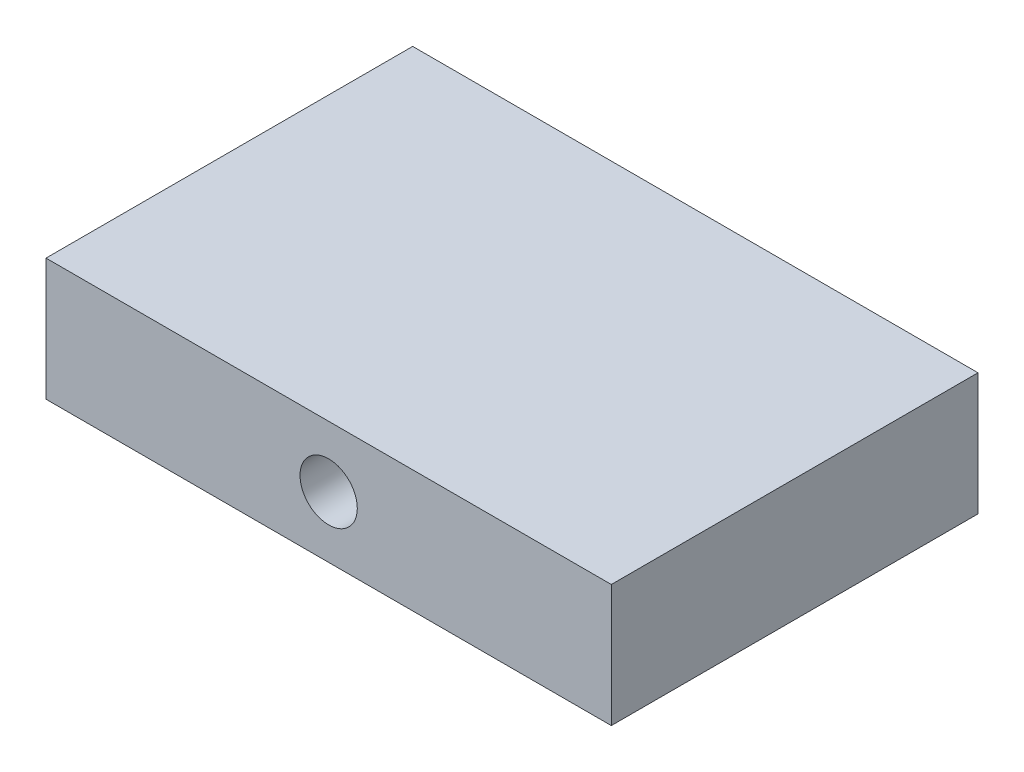
ISO-10303-21;
HEADER;
FILE_DESCRIPTION(('STEP AP214'),'2;1');
FILE_NAME('part.step','',(''),(''),'','','');
FILE_SCHEMA(('AUTOMOTIVE_DESIGN { 1 0 10303 214 1 1 1 1 }'));
ENDSEC;
DATA;
#1=APPLICATION_CONTEXT('core data for automotive mechanical design processes');
#2=APPLICATION_PROTOCOL_DEFINITION('international standard','automotive_design',2000,#1);
#3=PRODUCT_CONTEXT('',#1,'mechanical');
#4=PRODUCT('Part','Part','',(#3));
#5=PRODUCT_RELATED_PRODUCT_CATEGORY('part','',(#4));
#6=PRODUCT_DEFINITION_FORMATION('','',#4);
#7=PRODUCT_DEFINITION_CONTEXT('part definition',#1,'design');
#8=PRODUCT_DEFINITION('design','',#6,#7);
#9=PRODUCT_DEFINITION_SHAPE('','',#8);
#10=(LENGTH_UNIT() NAMED_UNIT(*) SI_UNIT(.MILLI.,.METRE.));
#11=(NAMED_UNIT(*) PLANE_ANGLE_UNIT() SI_UNIT($,.RADIAN.));
#12=(NAMED_UNIT(*) SI_UNIT($,.STERADIAN.) SOLID_ANGLE_UNIT());
#13=UNCERTAINTY_MEASURE_WITH_UNIT(LENGTH_MEASURE(1.E-05),#10,'distance_accuracy_value','');
#14=(GEOMETRIC_REPRESENTATION_CONTEXT(3) GLOBAL_UNCERTAINTY_ASSIGNED_CONTEXT((#13)) GLOBAL_UNIT_ASSIGNED_CONTEXT((#10,
#11,#12)) REPRESENTATION_CONTEXT('',''));
#15=CARTESIAN_POINT('',(0.,0.,0.));
#16=DIRECTION('',(0.,0.,1.));
#17=DIRECTION('',(1.,0.,0.));
#18=AXIS2_PLACEMENT_3D('',#15,#16,#17);
#19=CARTESIAN_POINT('',(-37.,16.,24.));
#20=DIRECTION('',(1.,0.,0.));
#21=DIRECTION('',(0.,0.,-1.));
#22=AXIS2_PLACEMENT_3D('',#19,#20,#21);
#23=PLANE('',#22);
#24=DIRECTION('',(0.,0.,1.));
#25=VECTOR('',#24,1.);
#26=CARTESIAN_POINT('',(-37.,0.,24.));
#27=LINE('',#26,#25);
#28=CARTESIAN_POINT('',(-37.,0.,-24.));
#29=VERTEX_POINT('',#28);
#30=CARTESIAN_POINT('',(-37.,0.,24.));
#31=VERTEX_POINT('',#30);
#32=EDGE_CURVE('E98',#29,#31,#27,.T.);
#33=ORIENTED_EDGE('',*,*,#32,.T.);
#34=DIRECTION('',(0.,-1.,0.));
#35=VECTOR('',#34,1.);
#36=CARTESIAN_POINT('',(-37.,16.,24.));
#37=LINE('',#36,#35);
#38=CARTESIAN_POINT('',(-37.,16.,24.));
#39=VERTEX_POINT('',#38);
#40=EDGE_CURVE('E11',#39,#31,#37,.T.);
#41=ORIENTED_EDGE('',*,*,#40,.F.);
#42=DIRECTION('',(0.,0.,1.));
#43=VECTOR('',#42,1.);
#44=CARTESIAN_POINT('',(-37.,16.,24.));
#45=LINE('',#44,#43);
#46=CARTESIAN_POINT('',(-37.,16.,-24.));
#47=VERTEX_POINT('',#46);
#48=EDGE_CURVE('E86',#47,#39,#45,.T.);
#49=ORIENTED_EDGE('',*,*,#48,.F.);
#50=DIRECTION('',(0.,-1.,0.));
#51=VECTOR('',#50,1.);
#52=CARTESIAN_POINT('',(-37.,16.,-24.));
#53=LINE('',#52,#51);
#54=EDGE_CURVE('E94',#47,#29,#53,.T.);
#55=ORIENTED_EDGE('',*,*,#54,.T.);
#56=EDGE_LOOP('',(#33,#41,#49,#55));
#57=FACE_BOUND('',#56,.T.);
#58=ADVANCED_FACE('F35',(#57),#23,.F.);
#59=CARTESIAN_POINT('',(37.,16.,24.));
#60=DIRECTION('',(0.,0.,-1.));
#61=DIRECTION('',(-1.,0.,0.));
#62=AXIS2_PLACEMENT_3D('',#59,#60,#61);
#63=PLANE('',#62);
#64=CARTESIAN_POINT('',(0.,8.,24.));
#65=DIRECTION('',(0.,0.,1.));
#66=DIRECTION('',(1.,0.,0.));
#67=AXIS2_PLACEMENT_3D('',#64,#65,#66);
#68=CIRCLE('',#67,3.75000000000001);
#69=CARTESIAN_POINT('',(3.75000000000001,8.,24.));
#70=VERTEX_POINT('',#69);
#71=EDGE_CURVE('E112',#70,#70,#68,.T.);
#72=ORIENTED_EDGE('',*,*,#71,.F.);
#73=EDGE_LOOP('',(#72));
#74=FACE_BOUND('',#73,.T.);
#75=DIRECTION('',(1.,0.,0.));
#76=VECTOR('',#75,1.);
#77=CARTESIAN_POINT('',(37.,0.,24.));
#78=LINE('',#77,#76);
#79=CARTESIAN_POINT('',(37.,0.,24.));
#80=VERTEX_POINT('',#79);
#81=EDGE_CURVE('E90',#31,#80,#78,.T.);
#82=ORIENTED_EDGE('',*,*,#81,.T.);
#83=DIRECTION('',(0.,-1.,0.));
#84=VECTOR('',#83,1.);
#85=CARTESIAN_POINT('',(37.,16.,24.));
#86=LINE('',#85,#84);
#87=CARTESIAN_POINT('',(37.,16.,24.));
#88=VERTEX_POINT('',#87);
#89=EDGE_CURVE('E43',#88,#80,#86,.T.);
#90=ORIENTED_EDGE('',*,*,#89,.F.);
#91=DIRECTION('',(1.,0.,0.));
#92=VECTOR('',#91,1.);
#93=CARTESIAN_POINT('',(37.,16.,24.));
#94=LINE('',#93,#92);
#95=EDGE_CURVE('E81',#39,#88,#94,.T.);
#96=ORIENTED_EDGE('',*,*,#95,.F.);
#97=ORIENTED_EDGE('',*,*,#40,.T.);
#98=EDGE_LOOP('',(#82,#90,#96,#97));
#99=FACE_BOUND('',#98,.T.);
#100=ADVANCED_FACE('F89',(#74,#99),#63,.F.);
#101=CARTESIAN_POINT('',(37.,16.,24.));
#102=DIRECTION('',(-1.,0.,0.));
#103=DIRECTION('',(0.,0.,1.));
#104=AXIS2_PLACEMENT_3D('',#101,#102,#103);
#105=PLANE('',#104);
#106=DIRECTION('',(0.,0.,-1.));
#107=VECTOR('',#106,1.);
#108=CARTESIAN_POINT('',(37.,0.,24.));
#109=LINE('',#108,#107);
#110=CARTESIAN_POINT('',(37.,0.,-24.));
#111=VERTEX_POINT('',#110);
#112=EDGE_CURVE('E68',#80,#111,#109,.T.);
#113=ORIENTED_EDGE('',*,*,#112,.T.);
#114=DIRECTION('',(0.,-1.,0.));
#115=VECTOR('',#114,1.);
#116=CARTESIAN_POINT('',(37.,16.,-24.));
#117=LINE('',#116,#115);
#118=CARTESIAN_POINT('',(37.,16.,-24.));
#119=VERTEX_POINT('',#118);
#120=EDGE_CURVE('E91',#119,#111,#117,.T.);
#121=ORIENTED_EDGE('',*,*,#120,.F.);
#122=DIRECTION('',(0.,0.,-1.));
#123=VECTOR('',#122,1.);
#124=CARTESIAN_POINT('',(37.,16.,24.));
#125=LINE('',#124,#123);
#126=EDGE_CURVE('E84',#88,#119,#125,.T.);
#127=ORIENTED_EDGE('',*,*,#126,.F.);
#128=ORIENTED_EDGE('',*,*,#89,.T.);
#129=EDGE_LOOP('',(#113,#121,#127,#128));
#130=FACE_BOUND('',#129,.T.);
#131=ADVANCED_FACE('F92',(#130),#105,.F.);
#132=CARTESIAN_POINT('',(37.,16.,-24.));
#133=DIRECTION('',(0.,0.,1.));
#134=DIRECTION('',(1.,0.,0.));
#135=AXIS2_PLACEMENT_3D('',#132,#133,#134);
#136=PLANE('',#135);
#137=CARTESIAN_POINT('',(0.,8.,-24.));
#138=DIRECTION('',(0.,0.,1.));
#139=DIRECTION('',(1.,0.,0.));
#140=AXIS2_PLACEMENT_3D('',#137,#138,#139);
#141=CIRCLE('',#140,3.75000000000001);
#142=CARTESIAN_POINT('',(3.75000000000001,8.,-24.));
#143=VERTEX_POINT('',#142);
#144=EDGE_CURVE('E101',#143,#143,#141,.T.);
#145=ORIENTED_EDGE('',*,*,#144,.T.);
#146=EDGE_LOOP('',(#145));
#147=FACE_BOUND('',#146,.T.);
#148=DIRECTION('',(-1.,0.,0.));
#149=VECTOR('',#148,1.);
#150=CARTESIAN_POINT('',(37.,0.,-24.));
#151=LINE('',#150,#149);
#152=EDGE_CURVE('E74',#111,#29,#151,.T.);
#153=ORIENTED_EDGE('',*,*,#152,.T.);
#154=ORIENTED_EDGE('',*,*,#54,.F.);
#155=DIRECTION('',(-1.,0.,0.));
#156=VECTOR('',#155,1.);
#157=CARTESIAN_POINT('',(37.,16.,-24.));
#158=LINE('',#157,#156);
#159=EDGE_CURVE('E51',#119,#47,#158,.T.);
#160=ORIENTED_EDGE('',*,*,#159,.F.);
#161=ORIENTED_EDGE('',*,*,#120,.T.);
#162=EDGE_LOOP('',(#153,#154,#160,#161));
#163=FACE_BOUND('',#162,.T.);
#164=ADVANCED_FACE('F106',(#147,#163),#136,.F.);
#165=CARTESIAN_POINT('',(0.,16.,0.));
#166=DIRECTION('',(0.,1.,0.));
#167=DIRECTION('',(0.,0.,1.));
#168=AXIS2_PLACEMENT_3D('',#165,#166,#167);
#169=PLANE('',#168);
#170=ORIENTED_EDGE('',*,*,#48,.T.);
#171=ORIENTED_EDGE('',*,*,#95,.T.);
#172=ORIENTED_EDGE('',*,*,#126,.T.);
#173=ORIENTED_EDGE('',*,*,#159,.T.);
#174=EDGE_LOOP('',(#170,#171,#172,#173));
#175=FACE_BOUND('',#174,.T.);
#176=ADVANCED_FACE('F82',(#175),#169,.T.);
#177=CARTESIAN_POINT('',(0.,0.,0.));
#178=DIRECTION('',(0.,1.,0.));
#179=DIRECTION('',(0.,0.,1.));
#180=AXIS2_PLACEMENT_3D('',#177,#178,#179);
#181=PLANE('',#180);
#182=ORIENTED_EDGE('',*,*,#32,.F.);
#183=ORIENTED_EDGE('',*,*,#152,.F.);
#184=ORIENTED_EDGE('',*,*,#112,.F.);
#185=ORIENTED_EDGE('',*,*,#81,.F.);
#186=EDGE_LOOP('',(#182,#183,#184,#185));
#187=FACE_BOUND('',#186,.T.);
#188=ADVANCED_FACE('F109',(#187),#181,.F.);
#189=CARTESIAN_POINT('',(0.,8.,-24.));
#190=DIRECTION('',(0.,0.,1.));
#191=DIRECTION('',(1.,0.,0.));
#192=AXIS2_PLACEMENT_3D('',#189,#190,#191);
#193=CYLINDRICAL_SURFACE('',#192,3.75000000000001);
#194=ORIENTED_EDGE('',*,*,#144,.F.);
#195=EDGE_LOOP('',(#194));
#196=FACE_BOUND('',#195,.T.);
#197=ORIENTED_EDGE('',*,*,#71,.T.);
#198=EDGE_LOOP('',(#197));
#199=FACE_BOUND('',#198,.T.);
#200=ADVANCED_FACE('F119',(#196,#199),#193,.F.);
#201=CLOSED_SHELL('',(#58,#100,#131,#164,#176,#188,#200));
#202=MANIFOLD_SOLID_BREP('B2',#201);
#203=ADVANCED_BREP_SHAPE_REPRESENTATION('',(#18,#202),#14);
#204=SHAPE_DEFINITION_REPRESENTATION(#9,#203);
ENDSEC;
END-ISO-10303-21;
